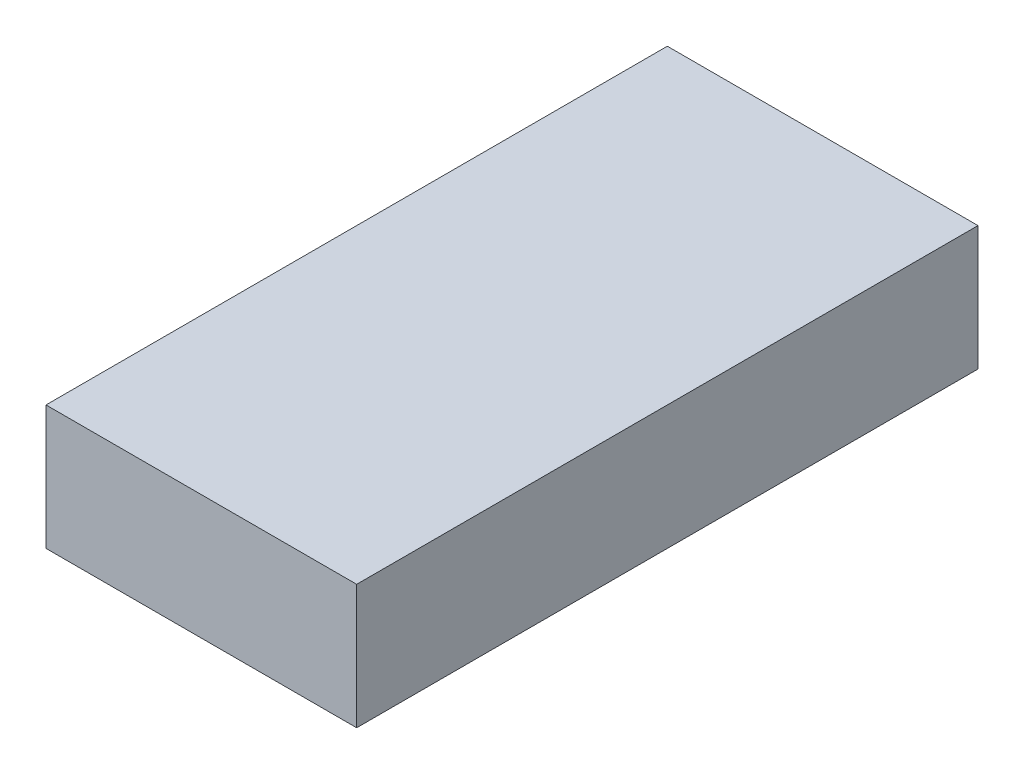
ISO-10303-21;
HEADER;
FILE_DESCRIPTION(('STEP AP214'),'2;1');
FILE_NAME('part.step','',(''),(''),'','','');
FILE_SCHEMA(('AUTOMOTIVE_DESIGN { 1 0 10303 214 1 1 1 1 }'));
ENDSEC;
DATA;
#1=APPLICATION_CONTEXT('core data for automotive mechanical design processes');
#2=APPLICATION_PROTOCOL_DEFINITION('international standard','automotive_design',2000,#1);
#3=PRODUCT_CONTEXT('',#1,'mechanical');
#4=PRODUCT('Part','Part','',(#3));
#5=PRODUCT_RELATED_PRODUCT_CATEGORY('part','',(#4));
#6=PRODUCT_DEFINITION_FORMATION('','',#4);
#7=PRODUCT_DEFINITION_CONTEXT('part definition',#1,'design');
#8=PRODUCT_DEFINITION('design','',#6,#7);
#9=PRODUCT_DEFINITION_SHAPE('','',#8);
#10=(LENGTH_UNIT() NAMED_UNIT(*) SI_UNIT(.MILLI.,.METRE.));
#11=(NAMED_UNIT(*) PLANE_ANGLE_UNIT() SI_UNIT($,.RADIAN.));
#12=(NAMED_UNIT(*) SI_UNIT($,.STERADIAN.) SOLID_ANGLE_UNIT());
#13=UNCERTAINTY_MEASURE_WITH_UNIT(LENGTH_MEASURE(1.E-05),#10,'distance_accuracy_value','');
#14=(GEOMETRIC_REPRESENTATION_CONTEXT(3) GLOBAL_UNCERTAINTY_ASSIGNED_CONTEXT((#13)) GLOBAL_UNIT_ASSIGNED_CONTEXT((#10,
#11,#12)) REPRESENTATION_CONTEXT('',''));
#15=CARTESIAN_POINT('',(0.,0.,0.));
#16=DIRECTION('',(0.,0.,1.));
#17=DIRECTION('',(1.,0.,0.));
#18=AXIS2_PLACEMENT_3D('',#15,#16,#17);
#19=CARTESIAN_POINT('',(0.,0.,16.));
#20=DIRECTION('',(1.,0.,0.));
#21=DIRECTION('',(0.,1.,0.));
#22=AXIS2_PLACEMENT_3D('',#19,#20,#21);
#23=PLANE('',#22);
#24=DIRECTION('',(0.,-1.,0.));
#25=VECTOR('',#24,1.);
#26=CARTESIAN_POINT('',(0.,0.,0.));
#27=LINE('',#26,#25);
#28=CARTESIAN_POINT('',(0.,3.2,0.));
#29=VERTEX_POINT('',#28);
#30=CARTESIAN_POINT('',(0.,0.,0.));
#31=VERTEX_POINT('',#30);
#32=EDGE_CURVE('E161',#29,#31,#27,.T.);
#33=ORIENTED_EDGE('',*,*,#32,.T.);
#34=DIRECTION('',(0.,0.,-1.));
#35=VECTOR('',#34,1.);
#36=CARTESIAN_POINT('',(0.,0.,16.));
#37=LINE('',#36,#35);
#38=CARTESIAN_POINT('',(0.,0.,16.));
#39=VERTEX_POINT('',#38);
#40=EDGE_CURVE('E11',#39,#31,#37,.T.);
#41=ORIENTED_EDGE('',*,*,#40,.F.);
#42=DIRECTION('',(0.,-1.,0.));
#43=VECTOR('',#42,1.);
#44=CARTESIAN_POINT('',(0.,0.,16.));
#45=LINE('',#44,#43);
#46=CARTESIAN_POINT('',(0.,3.2,16.));
#47=VERTEX_POINT('',#46);
#48=EDGE_CURVE('E167',#47,#39,#45,.T.);
#49=ORIENTED_EDGE('',*,*,#48,.F.);
#50=DIRECTION('',(0.,0.,-1.));
#51=VECTOR('',#50,1.);
#52=CARTESIAN_POINT('',(0.,3.2,16.));
#53=LINE('',#52,#51);
#54=EDGE_CURVE('E177',#47,#29,#53,.T.);
#55=ORIENTED_EDGE('',*,*,#54,.T.);
#56=EDGE_LOOP('',(#33,#41,#49,#55));
#57=FACE_BOUND('',#56,.T.);
#58=ADVANCED_FACE('F42',(#57),#23,.F.);
#59=CARTESIAN_POINT('',(0.,0.,16.));
#60=DIRECTION('',(0.,1.,0.));
#61=DIRECTION('',(0.,0.,1.));
#62=AXIS2_PLACEMENT_3D('',#59,#60,#61);
#63=PLANE('',#62);
#64=DIRECTION('',(1.,0.,0.));
#65=VECTOR('',#64,1.);
#66=CARTESIAN_POINT('',(1.6,0.,1.6));
#67=LINE('',#66,#65);
#68=CARTESIAN_POINT('',(1.6,0.,1.6));
#69=VERTEX_POINT('',#68);
#70=CARTESIAN_POINT('',(6.4,0.,1.6));
#71=VERTEX_POINT('',#70);
#72=EDGE_CURVE('E152',#69,#71,#67,.T.);
#73=ORIENTED_EDGE('',*,*,#72,.F.);
#74=DIRECTION('',(0.,0.,-1.));
#75=VECTOR('',#74,1.);
#76=CARTESIAN_POINT('',(1.6,0.,14.4));
#77=LINE('',#76,#75);
#78=CARTESIAN_POINT('',(1.6,0.,14.4));
#79=VERTEX_POINT('',#78);
#80=EDGE_CURVE('E57',#79,#69,#77,.T.);
#81=ORIENTED_EDGE('',*,*,#80,.F.);
#82=DIRECTION('',(-1.,0.,0.));
#83=VECTOR('',#82,1.);
#84=CARTESIAN_POINT('',(1.6,0.,14.4));
#85=LINE('',#84,#83);
#86=CARTESIAN_POINT('',(6.4,0.,14.4));
#87=VERTEX_POINT('',#86);
#88=EDGE_CURVE('E139',#87,#79,#85,.T.);
#89=ORIENTED_EDGE('',*,*,#88,.F.);
#90=DIRECTION('',(0.,0.,1.));
#91=VECTOR('',#90,1.);
#92=CARTESIAN_POINT('',(6.4,0.,14.4));
#93=LINE('',#92,#91);
#94=EDGE_CURVE('E143',#71,#87,#93,.T.);
#95=ORIENTED_EDGE('',*,*,#94,.F.);
#96=EDGE_LOOP('',(#73,#81,#89,#95));
#97=FACE_BOUND('',#96,.T.);
#98=DIRECTION('',(1.,0.,0.));
#99=VECTOR('',#98,1.);
#100=CARTESIAN_POINT('',(0.,0.,0.));
#101=LINE('',#100,#99);
#102=CARTESIAN_POINT('',(8.,0.,0.));
#103=VERTEX_POINT('',#102);
#104=EDGE_CURVE('E181',#31,#103,#101,.T.);
#105=ORIENTED_EDGE('',*,*,#104,.T.);
#106=DIRECTION('',(0.,0.,-1.));
#107=VECTOR('',#106,1.);
#108=CARTESIAN_POINT('',(8.,0.,16.));
#109=LINE('',#108,#107);
#110=CARTESIAN_POINT('',(8.,0.,16.));
#111=VERTEX_POINT('',#110);
#112=EDGE_CURVE('E50',#111,#103,#109,.T.);
#113=ORIENTED_EDGE('',*,*,#112,.F.);
#114=DIRECTION('',(1.,0.,0.));
#115=VECTOR('',#114,1.);
#116=CARTESIAN_POINT('',(0.,0.,16.));
#117=LINE('',#116,#115);
#118=EDGE_CURVE('E94',#39,#111,#117,.T.);
#119=ORIENTED_EDGE('',*,*,#118,.F.);
#120=ORIENTED_EDGE('',*,*,#40,.T.);
#121=EDGE_LOOP('',(#105,#113,#119,#120));
#122=FACE_BOUND('',#121,.T.);
#123=ADVANCED_FACE('F215',(#97,#122),#63,.F.);
#124=CARTESIAN_POINT('',(8.,0.,16.));
#125=DIRECTION('',(-1.,0.,0.));
#126=DIRECTION('',(0.,-1.,0.));
#127=AXIS2_PLACEMENT_3D('',#124,#125,#126);
#128=PLANE('',#127);
#129=DIRECTION('',(0.,1.,0.));
#130=VECTOR('',#129,1.);
#131=CARTESIAN_POINT('',(8.,0.,0.));
#132=LINE('',#131,#130);
#133=CARTESIAN_POINT('',(8.,3.2,0.));
#134=VERTEX_POINT('',#133);
#135=EDGE_CURVE('E184',#103,#134,#132,.T.);
#136=ORIENTED_EDGE('',*,*,#135,.T.);
#137=DIRECTION('',(0.,0.,-1.));
#138=VECTOR('',#137,1.);
#139=CARTESIAN_POINT('',(8.,3.2,16.));
#140=LINE('',#139,#138);
#141=CARTESIAN_POINT('',(8.,3.2,16.));
#142=VERTEX_POINT('',#141);
#143=EDGE_CURVE('E191',#142,#134,#140,.T.);
#144=ORIENTED_EDGE('',*,*,#143,.F.);
#145=DIRECTION('',(0.,1.,0.));
#146=VECTOR('',#145,1.);
#147=CARTESIAN_POINT('',(8.,0.,16.));
#148=LINE('',#147,#146);
#149=EDGE_CURVE('E172',#111,#142,#148,.T.);
#150=ORIENTED_EDGE('',*,*,#149,.F.);
#151=ORIENTED_EDGE('',*,*,#112,.T.);
#152=EDGE_LOOP('',(#136,#144,#150,#151));
#153=FACE_BOUND('',#152,.T.);
#154=ADVANCED_FACE('F198',(#153),#128,.F.);
#155=CARTESIAN_POINT('',(0.,3.2,16.));
#156=DIRECTION('',(0.,-1.,0.));
#157=DIRECTION('',(0.,0.,-1.));
#158=AXIS2_PLACEMENT_3D('',#155,#156,#157);
#159=PLANE('',#158);
#160=DIRECTION('',(-1.,0.,0.));
#161=VECTOR('',#160,1.);
#162=CARTESIAN_POINT('',(0.,3.2,0.));
#163=LINE('',#162,#161);
#164=EDGE_CURVE('E87',#134,#29,#163,.T.);
#165=ORIENTED_EDGE('',*,*,#164,.T.);
#166=ORIENTED_EDGE('',*,*,#54,.F.);
#167=DIRECTION('',(-1.,0.,0.));
#168=VECTOR('',#167,1.);
#169=CARTESIAN_POINT('',(0.,3.2,16.));
#170=LINE('',#169,#168);
#171=EDGE_CURVE('E66',#142,#47,#170,.T.);
#172=ORIENTED_EDGE('',*,*,#171,.F.);
#173=ORIENTED_EDGE('',*,*,#143,.T.);
#174=EDGE_LOOP('',(#165,#166,#172,#173));
#175=FACE_BOUND('',#174,.T.);
#176=ADVANCED_FACE('F206',(#175),#159,.F.);
#177=CARTESIAN_POINT('',(0.,0.,16.));
#178=DIRECTION('',(0.,0.,-1.));
#179=DIRECTION('',(-1.,0.,0.));
#180=AXIS2_PLACEMENT_3D('',#177,#178,#179);
#181=PLANE('',#180);
#182=ORIENTED_EDGE('',*,*,#48,.T.);
#183=ORIENTED_EDGE('',*,*,#118,.T.);
#184=ORIENTED_EDGE('',*,*,#149,.T.);
#185=ORIENTED_EDGE('',*,*,#171,.T.);
#186=EDGE_LOOP('',(#182,#183,#184,#185));
#187=FACE_BOUND('',#186,.T.);
#188=ADVANCED_FACE('F208',(#187),#181,.F.);
#189=CARTESIAN_POINT('',(0.,0.,0.));
#190=DIRECTION('',(0.,0.,-1.));
#191=DIRECTION('',(-1.,0.,0.));
#192=AXIS2_PLACEMENT_3D('',#189,#190,#191);
#193=PLANE('',#192);
#194=ORIENTED_EDGE('',*,*,#32,.F.);
#195=ORIENTED_EDGE('',*,*,#164,.F.);
#196=ORIENTED_EDGE('',*,*,#135,.F.);
#197=ORIENTED_EDGE('',*,*,#104,.F.);
#198=EDGE_LOOP('',(#194,#195,#196,#197));
#199=FACE_BOUND('',#198,.T.);
#200=ADVANCED_FACE('F202',(#199),#193,.T.);
#201=CARTESIAN_POINT('',(1.6,1.8,14.4));
#202=DIRECTION('',(-1.,0.,0.));
#203=DIRECTION('',(0.,0.,1.));
#204=AXIS2_PLACEMENT_3D('',#201,#202,#203);
#205=PLANE('',#204);
#206=ORIENTED_EDGE('',*,*,#80,.T.);
#207=DIRECTION('',(0.,-1.,0.));
#208=VECTOR('',#207,1.);
#209=CARTESIAN_POINT('',(1.6,1.8,1.6));
#210=LINE('',#209,#208);
#211=CARTESIAN_POINT('',(1.6,1.8,1.6));
#212=VERTEX_POINT('',#211);
#213=EDGE_CURVE('E114',#212,#69,#210,.T.);
#214=ORIENTED_EDGE('',*,*,#213,.F.);
#215=DIRECTION('',(0.,0.,-1.));
#216=VECTOR('',#215,1.);
#217=CARTESIAN_POINT('',(1.6,1.8,14.4));
#218=LINE('',#217,#216);
#219=CARTESIAN_POINT('',(1.6,1.8,14.4));
#220=VERTEX_POINT('',#219);
#221=EDGE_CURVE('E118',#220,#212,#218,.T.);
#222=ORIENTED_EDGE('',*,*,#221,.F.);
#223=DIRECTION('',(0.,-1.,0.));
#224=VECTOR('',#223,1.);
#225=CARTESIAN_POINT('',(1.6,1.8,14.4));
#226=LINE('',#225,#224);
#227=EDGE_CURVE('E158',#220,#79,#226,.T.);
#228=ORIENTED_EDGE('',*,*,#227,.T.);
#229=EDGE_LOOP('',(#206,#214,#222,#228));
#230=FACE_BOUND('',#229,.T.);
#231=ADVANCED_FACE('F116',(#230),#205,.F.);
#232=CARTESIAN_POINT('',(1.6,1.8,14.4));
#233=DIRECTION('',(0.,0.,1.));
#234=DIRECTION('',(1.,0.,0.));
#235=AXIS2_PLACEMENT_3D('',#232,#233,#234);
#236=PLANE('',#235);
#237=ORIENTED_EDGE('',*,*,#88,.T.);
#238=ORIENTED_EDGE('',*,*,#227,.F.);
#239=DIRECTION('',(-1.,0.,0.));
#240=VECTOR('',#239,1.);
#241=CARTESIAN_POINT('',(1.6,1.8,14.4));
#242=LINE('',#241,#240);
#243=CARTESIAN_POINT('',(6.4,1.8,14.4));
#244=VERTEX_POINT('',#243);
#245=EDGE_CURVE('E125',#244,#220,#242,.T.);
#246=ORIENTED_EDGE('',*,*,#245,.F.);
#247=DIRECTION('',(0.,-1.,0.));
#248=VECTOR('',#247,1.);
#249=CARTESIAN_POINT('',(6.4,1.8,14.4));
#250=LINE('',#249,#248);
#251=EDGE_CURVE('E162',#244,#87,#250,.T.);
#252=ORIENTED_EDGE('',*,*,#251,.T.);
#253=EDGE_LOOP('',(#237,#238,#246,#252));
#254=FACE_BOUND('',#253,.T.);
#255=ADVANCED_FACE('F230',(#254),#236,.F.);
#256=CARTESIAN_POINT('',(6.4,1.8,14.4));
#257=DIRECTION('',(1.,0.,0.));
#258=DIRECTION('',(0.,0.,-1.));
#259=AXIS2_PLACEMENT_3D('',#256,#257,#258);
#260=PLANE('',#259);
#261=ORIENTED_EDGE('',*,*,#94,.T.);
#262=ORIENTED_EDGE('',*,*,#251,.F.);
#263=DIRECTION('',(0.,0.,1.));
#264=VECTOR('',#263,1.);
#265=CARTESIAN_POINT('',(6.4,1.8,14.4));
#266=LINE('',#265,#264);
#267=CARTESIAN_POINT('',(6.4,1.8,1.6));
#268=VERTEX_POINT('',#267);
#269=EDGE_CURVE('E134',#268,#244,#266,.T.);
#270=ORIENTED_EDGE('',*,*,#269,.F.);
#271=DIRECTION('',(0.,-1.,0.));
#272=VECTOR('',#271,1.);
#273=CARTESIAN_POINT('',(6.4,1.8,1.6));
#274=LINE('',#273,#272);
#275=EDGE_CURVE('E124',#268,#71,#274,.T.);
#276=ORIENTED_EDGE('',*,*,#275,.T.);
#277=EDGE_LOOP('',(#261,#262,#270,#276));
#278=FACE_BOUND('',#277,.T.);
#279=ADVANCED_FACE('F228',(#278),#260,.F.);
#280=CARTESIAN_POINT('',(1.6,1.8,1.6));
#281=DIRECTION('',(0.,0.,-1.));
#282=DIRECTION('',(-1.,0.,0.));
#283=AXIS2_PLACEMENT_3D('',#280,#281,#282);
#284=PLANE('',#283);
#285=ORIENTED_EDGE('',*,*,#72,.T.);
#286=ORIENTED_EDGE('',*,*,#275,.F.);
#287=DIRECTION('',(1.,0.,0.));
#288=VECTOR('',#287,1.);
#289=CARTESIAN_POINT('',(1.6,1.8,1.6));
#290=LINE('',#289,#288);
#291=EDGE_CURVE('E128',#212,#268,#290,.T.);
#292=ORIENTED_EDGE('',*,*,#291,.F.);
#293=ORIENTED_EDGE('',*,*,#213,.T.);
#294=EDGE_LOOP('',(#285,#286,#292,#293));
#295=FACE_BOUND('',#294,.T.);
#296=ADVANCED_FACE('F129',(#295),#284,.F.);
#297=CARTESIAN_POINT('',(0.,1.8,0.));
#298=DIRECTION('',(0.,-1.,0.));
#299=DIRECTION('',(0.,0.,-1.));
#300=AXIS2_PLACEMENT_3D('',#297,#298,#299);
#301=PLANE('',#300);
#302=ORIENTED_EDGE('',*,*,#221,.T.);
#303=ORIENTED_EDGE('',*,*,#291,.T.);
#304=ORIENTED_EDGE('',*,*,#269,.T.);
#305=ORIENTED_EDGE('',*,*,#245,.T.);
#306=EDGE_LOOP('',(#302,#303,#304,#305));
#307=FACE_BOUND('',#306,.T.);
#308=ADVANCED_FACE('F136',(#307),#301,.T.);
#309=CLOSED_SHELL('',(#58,#123,#154,#176,#188,#200,#231,#255,#279,#296,#308));
#310=MANIFOLD_SOLID_BREP('B2',#309);
#311=ADVANCED_BREP_SHAPE_REPRESENTATION('',(#18,#310),#14);
#312=SHAPE_DEFINITION_REPRESENTATION(#9,#311);
ENDSEC;
END-ISO-10303-21;
